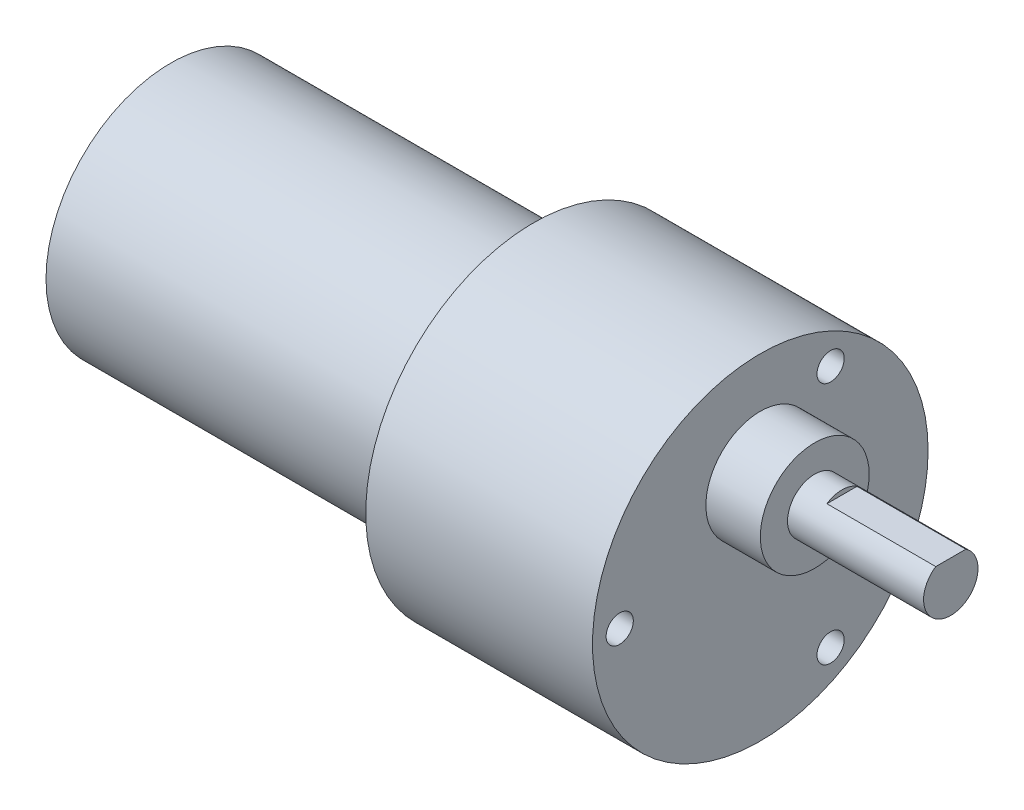
ISO-10303-21;
HEADER;
FILE_DESCRIPTION(('STEP AP214'),'2;1');
FILE_NAME('part.step','',(''),(''),'','','');
FILE_SCHEMA(('AUTOMOTIVE_DESIGN { 1 0 10303 214 1 1 1 1 }'));
ENDSEC;
DATA;
#1=APPLICATION_CONTEXT('core data for automotive mechanical design processes');
#2=APPLICATION_PROTOCOL_DEFINITION('international standard','automotive_design',2000,#1);
#3=PRODUCT_CONTEXT('',#1,'mechanical');
#4=PRODUCT('Part','Part','',(#3));
#5=PRODUCT_RELATED_PRODUCT_CATEGORY('part','',(#4));
#6=PRODUCT_DEFINITION_FORMATION('','',#4);
#7=PRODUCT_DEFINITION_CONTEXT('part definition',#1,'design');
#8=PRODUCT_DEFINITION('design','',#6,#7);
#9=PRODUCT_DEFINITION_SHAPE('','',#8);
#10=(LENGTH_UNIT() NAMED_UNIT(*) SI_UNIT(.MILLI.,.METRE.));
#11=(NAMED_UNIT(*) PLANE_ANGLE_UNIT() SI_UNIT($,.RADIAN.));
#12=(NAMED_UNIT(*) SI_UNIT($,.STERADIAN.) SOLID_ANGLE_UNIT());
#13=UNCERTAINTY_MEASURE_WITH_UNIT(LENGTH_MEASURE(1.E-05),#10,'distance_accuracy_value','');
#14=(GEOMETRIC_REPRESENTATION_CONTEXT(3) GLOBAL_UNCERTAINTY_ASSIGNED_CONTEXT((#13)) GLOBAL_UNIT_ASSIGNED_CONTEXT((#10,
#11,#12)) REPRESENTATION_CONTEXT('',''));
#15=CARTESIAN_POINT('',(0.,0.,0.));
#16=DIRECTION('',(0.,0.,1.));
#17=DIRECTION('',(1.,0.,0.));
#18=AXIS2_PLACEMENT_3D('',#15,#16,#17);
#19=CARTESIAN_POINT('',(20.,0.,0.));
#20=DIRECTION('',(-1.,0.,0.));
#21=DIRECTION('',(0.,0.,1.));
#22=AXIS2_PLACEMENT_3D('',#19,#20,#21);
#23=CYLINDRICAL_SURFACE('',#22,13.75);
#24=CARTESIAN_POINT('',(18.,0.,0.));
#25=DIRECTION('',(1.,0.,0.));
#26=DIRECTION('',(0.,0.,-1.));
#27=AXIS2_PLACEMENT_3D('',#24,#25,#26);
#28=CIRCLE('',#27,13.75);
#29=CARTESIAN_POINT('',(18.,0.,-13.75));
#30=VERTEX_POINT('',#29);
#31=EDGE_CURVE('E11',#30,#30,#28,.F.);
#32=ORIENTED_EDGE('',*,*,#31,.T.);
#33=EDGE_LOOP('',(#32));
#34=FACE_BOUND('',#33,.T.);
#35=CARTESIAN_POINT('',(-20.,0.,0.));
#36=DIRECTION('',(1.,0.,0.));
#37=DIRECTION('',(0.,0.,-1.));
#38=AXIS2_PLACEMENT_3D('',#35,#36,#37);
#39=CIRCLE('',#38,13.75);
#40=CARTESIAN_POINT('',(-20.,0.,-13.75));
#41=VERTEX_POINT('',#40);
#42=EDGE_CURVE('E100',#41,#41,#39,.T.);
#43=ORIENTED_EDGE('',*,*,#42,.T.);
#44=EDGE_LOOP('',(#43));
#45=FACE_BOUND('',#44,.T.);
#46=ADVANCED_FACE('F36',(#34,#45),#23,.T.);
#47=CARTESIAN_POINT('',(-20.,0.,0.));
#48=DIRECTION('',(1.,0.,0.));
#49=DIRECTION('',(0.,0.,-1.));
#50=AXIS2_PLACEMENT_3D('',#47,#48,#49);
#51=PLANE('',#50);
#52=CARTESIAN_POINT('',(-20.,0.,0.));
#53=DIRECTION('',(-1.,0.,0.));
#54=DIRECTION('',(0.,0.,1.));
#55=AXIS2_PLACEMENT_3D('',#52,#53,#54);
#56=CIRCLE('',#55,5.1);
#57=CARTESIAN_POINT('',(-20.,0.,5.1));
#58=VERTEX_POINT('',#57);
#59=EDGE_CURVE('E88',#58,#58,#56,.T.);
#60=ORIENTED_EDGE('',*,*,#59,.F.);
#61=EDGE_LOOP('',(#60));
#62=FACE_BOUND('',#61,.T.);
#63=ORIENTED_EDGE('',*,*,#42,.F.);
#64=EDGE_LOOP('',(#63));
#65=FACE_BOUND('',#64,.T.);
#66=ADVANCED_FACE('F121',(#62,#65),#51,.F.);
#67=CARTESIAN_POINT('',(-23.,0.,0.));
#68=DIRECTION('',(1.,0.,0.));
#69=DIRECTION('',(0.,0.,-1.));
#70=AXIS2_PLACEMENT_3D('',#67,#68,#69);
#71=CYLINDRICAL_SURFACE('',#70,5.1);
#72=CARTESIAN_POINT('',(-23.,0.,0.));
#73=DIRECTION('',(-1.,0.,0.));
#74=DIRECTION('',(0.,0.,1.));
#75=AXIS2_PLACEMENT_3D('',#72,#73,#74);
#76=CIRCLE('',#75,5.1);
#77=CARTESIAN_POINT('',(-23.,0.,5.1));
#78=VERTEX_POINT('',#77);
#79=EDGE_CURVE('E95',#78,#78,#76,.T.);
#80=ORIENTED_EDGE('',*,*,#79,.F.);
#81=EDGE_LOOP('',(#80));
#82=FACE_BOUND('',#81,.T.);
#83=ORIENTED_EDGE('',*,*,#59,.T.);
#84=EDGE_LOOP('',(#83));
#85=FACE_BOUND('',#84,.T.);
#86=ADVANCED_FACE('F126',(#82,#85),#71,.T.);
#87=CARTESIAN_POINT('',(-23.,0.,0.));
#88=DIRECTION('',(-1.,0.,0.));
#89=DIRECTION('',(0.,0.,1.));
#90=AXIS2_PLACEMENT_3D('',#87,#88,#89);
#91=PLANE('',#90);
#92=ORIENTED_EDGE('',*,*,#79,.T.);
#93=EDGE_LOOP('',(#92));
#94=FACE_BOUND('',#93,.T.);
#95=ADVANCED_FACE('F133',(#94),#91,.T.);
#96=CARTESIAN_POINT('',(45.,0.,0.));
#97=DIRECTION('',(-1.,0.,0.));
#98=DIRECTION('',(0.,0.,1.));
#99=AXIS2_PLACEMENT_3D('',#96,#97,#98);
#100=CYLINDRICAL_SURFACE('',#99,18.5);
#101=CARTESIAN_POINT('',(45.,0.,0.));
#102=DIRECTION('',(1.,0.,0.));
#103=DIRECTION('',(0.,0.,-1.));
#104=AXIS2_PLACEMENT_3D('',#101,#102,#103);
#105=CIRCLE('',#104,18.5);
#106=CARTESIAN_POINT('',(45.,0.,-18.5));
#107=VERTEX_POINT('',#106);
#108=EDGE_CURVE('E92',#107,#107,#105,.T.);
#109=ORIENTED_EDGE('',*,*,#108,.F.);
#110=EDGE_LOOP('',(#109));
#111=FACE_BOUND('',#110,.T.);
#112=CARTESIAN_POINT('',(20.,0.,0.));
#113=DIRECTION('',(1.,0.,0.));
#114=DIRECTION('',(0.,0.,-1.));
#115=AXIS2_PLACEMENT_3D('',#112,#113,#114);
#116=CIRCLE('',#115,18.5);
#117=CARTESIAN_POINT('',(20.,0.,-18.5));
#118=VERTEX_POINT('',#117);
#119=EDGE_CURVE('E90',#118,#118,#116,.T.);
#120=ORIENTED_EDGE('',*,*,#119,.T.);
#121=EDGE_LOOP('',(#120));
#122=FACE_BOUND('',#121,.T.);
#123=ADVANCED_FACE('F137',(#111,#122),#100,.T.);
#124=CARTESIAN_POINT('',(45.,0.,0.));
#125=DIRECTION('',(1.,0.,0.));
#126=DIRECTION('',(0.,0.,-1.));
#127=AXIS2_PLACEMENT_3D('',#124,#125,#126);
#128=PLANE('',#127);
#129=CARTESIAN_POINT('',(45.,0.,15.5));
#130=DIRECTION('',(1.,0.,0.));
#131=DIRECTION('',(0.,0.,-1.));
#132=AXIS2_PLACEMENT_3D('',#129,#130,#131);
#133=CIRCLE('',#132,1.5);
#134=CARTESIAN_POINT('',(45.,0.,14.));
#135=VERTEX_POINT('',#134);
#136=EDGE_CURVE('E191',#135,#135,#133,.T.);
#137=ORIENTED_EDGE('',*,*,#136,.F.);
#138=EDGE_LOOP('',(#137));
#139=FACE_BOUND('',#138,.T.);
#140=CARTESIAN_POINT('',(45.,13.4233937586588,-7.75000000000006));
#141=DIRECTION('',(1.,0.,0.));
#142=DIRECTION('',(0.,0.,-1.));
#143=AXIS2_PLACEMENT_3D('',#140,#141,#142);
#144=CIRCLE('',#143,1.5);
#145=CARTESIAN_POINT('',(45.,13.4233937586588,-9.25000000000006));
#146=VERTEX_POINT('',#145);
#147=EDGE_CURVE('E196',#146,#146,#144,.T.);
#148=ORIENTED_EDGE('',*,*,#147,.F.);
#149=EDGE_LOOP('',(#148));
#150=FACE_BOUND('',#149,.T.);
#151=CARTESIAN_POINT('',(45.,-13.4233937586589,-7.74999999999987));
#152=DIRECTION('',(1.,0.,0.));
#153=DIRECTION('',(0.,0.,-1.));
#154=AXIS2_PLACEMENT_3D('',#151,#152,#153);
#155=CIRCLE('',#154,1.5);
#156=CARTESIAN_POINT('',(45.,-13.4233937586589,-9.24999999999988));
#157=VERTEX_POINT('',#156);
#158=EDGE_CURVE('E204',#157,#157,#155,.T.);
#159=ORIENTED_EDGE('',*,*,#158,.F.);
#160=EDGE_LOOP('',(#159));
#161=FACE_BOUND('',#160,.T.);
#162=CARTESIAN_POINT('',(45.,7.,0.));
#163=DIRECTION('',(1.,0.,0.));
#164=DIRECTION('',(0.,0.,-1.));
#165=AXIS2_PLACEMENT_3D('',#162,#163,#164);
#166=CIRCLE('',#165,6.);
#167=CARTESIAN_POINT('',(45.,7.,-6.));
#168=VERTEX_POINT('',#167);
#169=EDGE_CURVE('E78',#168,#168,#166,.T.);
#170=ORIENTED_EDGE('',*,*,#169,.F.);
#171=EDGE_LOOP('',(#170));
#172=FACE_BOUND('',#171,.T.);
#173=ORIENTED_EDGE('',*,*,#108,.T.);
#174=EDGE_LOOP('',(#173));
#175=FACE_BOUND('',#174,.T.);
#176=ADVANCED_FACE('F141',(#139,#150,#161,#172,#175),#128,.T.);
#177=CARTESIAN_POINT('',(20.,0.,0.));
#178=DIRECTION('',(1.,0.,0.));
#179=DIRECTION('',(0.,0.,-1.));
#180=AXIS2_PLACEMENT_3D('',#177,#178,#179);
#181=PLANE('',#180);
#182=CARTESIAN_POINT('',(20.,0.,0.));
#183=DIRECTION('',(1.,0.,0.));
#184=DIRECTION('',(0.,0.,-1.));
#185=AXIS2_PLACEMENT_3D('',#182,#183,#184);
#186=CIRCLE('',#185,15.75);
#187=CARTESIAN_POINT('',(20.,0.,-15.75));
#188=VERTEX_POINT('',#187);
#189=EDGE_CURVE('E45',#188,#188,#186,.T.);
#190=ORIENTED_EDGE('',*,*,#189,.T.);
#191=EDGE_LOOP('',(#190));
#192=FACE_BOUND('',#191,.T.);
#193=ORIENTED_EDGE('',*,*,#119,.F.);
#194=EDGE_LOOP('',(#193));
#195=FACE_BOUND('',#194,.T.);
#196=ADVANCED_FACE('F107',(#192,#195),#181,.F.);
#197=CARTESIAN_POINT('',(51.,7.,0.));
#198=DIRECTION('',(-1.,0.,0.));
#199=DIRECTION('',(0.,0.,1.));
#200=AXIS2_PLACEMENT_3D('',#197,#198,#199);
#201=CYLINDRICAL_SURFACE('',#200,6.);
#202=CARTESIAN_POINT('',(51.,7.,0.));
#203=DIRECTION('',(1.,0.,0.));
#204=DIRECTION('',(0.,0.,-1.));
#205=AXIS2_PLACEMENT_3D('',#202,#203,#204);
#206=CIRCLE('',#205,6.);
#207=CARTESIAN_POINT('',(51.,7.,-6.));
#208=VERTEX_POINT('',#207);
#209=EDGE_CURVE('E81',#208,#208,#206,.T.);
#210=ORIENTED_EDGE('',*,*,#209,.F.);
#211=EDGE_LOOP('',(#210));
#212=FACE_BOUND('',#211,.T.);
#213=ORIENTED_EDGE('',*,*,#169,.T.);
#214=EDGE_LOOP('',(#213));
#215=FACE_BOUND('',#214,.T.);
#216=ADVANCED_FACE('F145',(#212,#215),#201,.T.);
#217=CARTESIAN_POINT('',(51.,7.,0.));
#218=DIRECTION('',(1.,0.,0.));
#219=DIRECTION('',(0.,0.,-1.));
#220=AXIS2_PLACEMENT_3D('',#217,#218,#219);
#221=PLANE('',#220);
#222=CARTESIAN_POINT('',(51.,7.,0.));
#223=DIRECTION('',(1.,0.,0.));
#224=DIRECTION('',(0.,0.,-1.));
#225=AXIS2_PLACEMENT_3D('',#222,#223,#224);
#226=CIRCLE('',#225,3.);
#227=CARTESIAN_POINT('',(51.,7.,-3.));
#228=VERTEX_POINT('',#227);
#229=EDGE_CURVE('E85',#228,#228,#226,.T.);
#230=ORIENTED_EDGE('',*,*,#229,.F.);
#231=EDGE_LOOP('',(#230));
#232=FACE_BOUND('',#231,.T.);
#233=ORIENTED_EDGE('',*,*,#209,.T.);
#234=EDGE_LOOP('',(#233));
#235=FACE_BOUND('',#234,.T.);
#236=ADVANCED_FACE('F151',(#232,#235),#221,.T.);
#237=CARTESIAN_POINT('',(66.,7.,0.));
#238=DIRECTION('',(-1.,0.,0.));
#239=DIRECTION('',(0.,0.,1.));
#240=AXIS2_PLACEMENT_3D('',#237,#238,#239);
#241=CYLINDRICAL_SURFACE('',#240,3.);
#242=CARTESIAN_POINT('',(66.,7.,0.));
#243=DIRECTION('',(1.,0.,0.));
#244=DIRECTION('',(0.,0.,-1.));
#245=AXIS2_PLACEMENT_3D('',#242,#243,#244);
#246=CIRCLE('',#245,3.);
#247=CARTESIAN_POINT('',(66.,9.5,1.6583123951777));
#248=VERTEX_POINT('',#247);
#249=CARTESIAN_POINT('',(66.,9.5,-1.6583123951777));
#250=VERTEX_POINT('',#249);
#251=EDGE_CURVE('E75',#248,#250,#246,.T.);
#252=ORIENTED_EDGE('',*,*,#251,.F.);
#253=DIRECTION('',(1.,0.,0.));
#254=VECTOR('',#253,1.);
#255=CARTESIAN_POINT('',(54.,9.5,1.6583123951777));
#256=LINE('',#255,#254);
#257=CARTESIAN_POINT('',(54.,9.5,1.6583123951777));
#258=VERTEX_POINT('',#257);
#259=EDGE_CURVE('E52',#258,#248,#256,.T.);
#260=ORIENTED_EDGE('',*,*,#259,.F.);
#261=CARTESIAN_POINT('',(54.,7.,0.));
#262=DIRECTION('',(1.,0.,0.));
#263=DIRECTION('',(0.,0.,-1.));
#264=AXIS2_PLACEMENT_3D('',#261,#262,#263);
#265=CIRCLE('',#264,3.);
#266=CARTESIAN_POINT('',(54.,9.5,-1.6583123951777));
#267=VERTEX_POINT('',#266);
#268=EDGE_CURVE('E68',#267,#258,#265,.T.);
#269=ORIENTED_EDGE('',*,*,#268,.F.);
#270=DIRECTION('',(1.,0.,0.));
#271=VECTOR('',#270,1.);
#272=CARTESIAN_POINT('',(54.,9.5,-1.6583123951777));
#273=LINE('',#272,#271);
#274=EDGE_CURVE('E58',#267,#250,#273,.T.);
#275=ORIENTED_EDGE('',*,*,#274,.T.);
#276=EDGE_LOOP('',(#252,#260,#269,#275));
#277=FACE_BOUND('',#276,.T.);
#278=ORIENTED_EDGE('',*,*,#229,.T.);
#279=EDGE_LOOP('',(#278));
#280=FACE_BOUND('',#279,.T.);
#281=ADVANCED_FACE('F73',(#277,#280),#241,.T.);
#282=CARTESIAN_POINT('',(66.,7.,0.));
#283=DIRECTION('',(1.,0.,0.));
#284=DIRECTION('',(0.,0.,-1.));
#285=AXIS2_PLACEMENT_3D('',#282,#283,#284);
#286=PLANE('',#285);
#287=DIRECTION('',(0.,0.,-1.));
#288=VECTOR('',#287,1.);
#289=CARTESIAN_POINT('',(66.,9.5,0.));
#290=LINE('',#289,#288);
#291=EDGE_CURVE('E63',#248,#250,#290,.T.);
#292=ORIENTED_EDGE('',*,*,#291,.F.);
#293=ORIENTED_EDGE('',*,*,#251,.T.);
#294=EDGE_LOOP('',(#292,#293));
#295=FACE_BOUND('',#294,.T.);
#296=ADVANCED_FACE('F77',(#295),#286,.T.);
#297=CARTESIAN_POINT('',(54.,9.5,0.));
#298=DIRECTION('',(0.,-1.,0.));
#299=DIRECTION('',(0.,0.,-1.));
#300=AXIS2_PLACEMENT_3D('',#297,#298,#299);
#301=PLANE('',#300);
#302=ORIENTED_EDGE('',*,*,#291,.T.);
#303=ORIENTED_EDGE('',*,*,#274,.F.);
#304=DIRECTION('',(0.,0.,-1.));
#305=VECTOR('',#304,1.);
#306=CARTESIAN_POINT('',(54.,9.5,0.));
#307=LINE('',#306,#305);
#308=EDGE_CURVE('E208',#258,#267,#307,.T.);
#309=ORIENTED_EDGE('',*,*,#308,.F.);
#310=ORIENTED_EDGE('',*,*,#259,.T.);
#311=EDGE_LOOP('',(#302,#303,#309,#310));
#312=FACE_BOUND('',#311,.T.);
#313=ADVANCED_FACE('F64',(#312),#301,.F.);
#314=CARTESIAN_POINT('',(54.,0.,0.));
#315=DIRECTION('',(1.,0.,0.));
#316=DIRECTION('',(0.,0.,-1.));
#317=AXIS2_PLACEMENT_3D('',#314,#315,#316);
#318=PLANE('',#317);
#319=ORIENTED_EDGE('',*,*,#268,.T.);
#320=ORIENTED_EDGE('',*,*,#308,.T.);
#321=EDGE_LOOP('',(#319,#320));
#322=FACE_BOUND('',#321,.T.);
#323=ADVANCED_FACE('F162',(#322),#318,.T.);
#324=CARTESIAN_POINT('',(42.,-13.4233937586589,-7.74999999999987));
#325=DIRECTION('',(1.,0.,0.));
#326=DIRECTION('',(0.,0.,-1.));
#327=AXIS2_PLACEMENT_3D('',#324,#325,#326);
#328=CYLINDRICAL_SURFACE('',#327,1.5);
#329=CARTESIAN_POINT('',(42.,-13.4233937586589,-7.74999999999987));
#330=DIRECTION('',(1.,0.,0.));
#331=DIRECTION('',(0.,0.,-1.));
#332=AXIS2_PLACEMENT_3D('',#329,#330,#331);
#333=CIRCLE('',#332,1.5);
#334=CARTESIAN_POINT('',(42.,-13.4233937586589,-9.24999999999988));
#335=VERTEX_POINT('',#334);
#336=EDGE_CURVE('E201',#335,#335,#333,.T.);
#337=ORIENTED_EDGE('',*,*,#336,.F.);
#338=EDGE_LOOP('',(#337));
#339=FACE_BOUND('',#338,.T.);
#340=ORIENTED_EDGE('',*,*,#158,.T.);
#341=EDGE_LOOP('',(#340));
#342=FACE_BOUND('',#341,.T.);
#343=ADVANCED_FACE('F165',(#339,#342),#328,.F.);
#344=CARTESIAN_POINT('',(42.,-13.4233937586589,-7.74999999999987));
#345=DIRECTION('',(1.,0.,0.));
#346=DIRECTION('',(0.,0.,-1.));
#347=AXIS2_PLACEMENT_3D('',#344,#345,#346);
#348=PLANE('',#347);
#349=ORIENTED_EDGE('',*,*,#336,.T.);
#350=EDGE_LOOP('',(#349));
#351=FACE_BOUND('',#350,.T.);
#352=ADVANCED_FACE('F169',(#351),#348,.T.);
#353=CARTESIAN_POINT('',(42.,13.4233937586588,-7.75000000000006));
#354=DIRECTION('',(1.,0.,0.));
#355=DIRECTION('',(0.,0.,-1.));
#356=AXIS2_PLACEMENT_3D('',#353,#354,#355);
#357=CYLINDRICAL_SURFACE('',#356,1.5);
#358=CARTESIAN_POINT('',(42.,13.4233937586588,-7.75000000000006));
#359=DIRECTION('',(1.,0.,0.));
#360=DIRECTION('',(0.,0.,-1.));
#361=AXIS2_PLACEMENT_3D('',#358,#359,#360);
#362=CIRCLE('',#361,1.5);
#363=CARTESIAN_POINT('',(42.,13.4233937586588,-9.25000000000006));
#364=VERTEX_POINT('',#363);
#365=EDGE_CURVE('E192',#364,#364,#362,.T.);
#366=ORIENTED_EDGE('',*,*,#365,.F.);
#367=EDGE_LOOP('',(#366));
#368=FACE_BOUND('',#367,.T.);
#369=ORIENTED_EDGE('',*,*,#147,.T.);
#370=EDGE_LOOP('',(#369));
#371=FACE_BOUND('',#370,.T.);
#372=ADVANCED_FACE('F173',(#368,#371),#357,.F.);
#373=CARTESIAN_POINT('',(42.,13.4233937586588,-7.75000000000006));
#374=DIRECTION('',(1.,0.,0.));
#375=DIRECTION('',(0.,0.,-1.));
#376=AXIS2_PLACEMENT_3D('',#373,#374,#375);
#377=PLANE('',#376);
#378=ORIENTED_EDGE('',*,*,#365,.T.);
#379=EDGE_LOOP('',(#378));
#380=FACE_BOUND('',#379,.T.);
#381=ADVANCED_FACE('F177',(#380),#377,.T.);
#382=CARTESIAN_POINT('',(42.,0.,15.5));
#383=DIRECTION('',(1.,0.,0.));
#384=DIRECTION('',(0.,0.,-1.));
#385=AXIS2_PLACEMENT_3D('',#382,#383,#384);
#386=CYLINDRICAL_SURFACE('',#385,1.5);
#387=CARTESIAN_POINT('',(42.,0.,15.5));
#388=DIRECTION('',(1.,0.,0.));
#389=DIRECTION('',(0.,0.,-1.));
#390=AXIS2_PLACEMENT_3D('',#387,#388,#389);
#391=CIRCLE('',#390,1.5);
#392=CARTESIAN_POINT('',(42.,0.,14.));
#393=VERTEX_POINT('',#392);
#394=EDGE_CURVE('E69',#393,#393,#391,.T.);
#395=ORIENTED_EDGE('',*,*,#394,.F.);
#396=EDGE_LOOP('',(#395));
#397=FACE_BOUND('',#396,.T.);
#398=ORIENTED_EDGE('',*,*,#136,.T.);
#399=EDGE_LOOP('',(#398));
#400=FACE_BOUND('',#399,.T.);
#401=ADVANCED_FACE('F116',(#397,#400),#386,.F.);
#402=CARTESIAN_POINT('',(42.,0.,15.5));
#403=DIRECTION('',(1.,0.,0.));
#404=DIRECTION('',(0.,0.,-1.));
#405=AXIS2_PLACEMENT_3D('',#402,#403,#404);
#406=PLANE('',#405);
#407=ORIENTED_EDGE('',*,*,#394,.T.);
#408=EDGE_LOOP('',(#407));
#409=FACE_BOUND('',#408,.T.);
#410=ADVANCED_FACE('F111',(#409),#406,.T.);
#411=CARTESIAN_POINT('',(20.,0.,0.));
#412=DIRECTION('',(1.,0.,0.));
#413=DIRECTION('',(0.,0.,-1.));
#414=AXIS2_PLACEMENT_3D('',#411,#412,#413);
#415=CONICAL_SURFACE('',#414,15.75,0.785398163397452);
#416=ORIENTED_EDGE('',*,*,#31,.F.);
#417=EDGE_LOOP('',(#416));
#418=FACE_BOUND('',#417,.T.);
#419=ORIENTED_EDGE('',*,*,#189,.F.);
#420=EDGE_LOOP('',(#419));
#421=FACE_BOUND('',#420,.T.);
#422=ADVANCED_FACE('F39',(#418,#421),#415,.T.);
#423=CLOSED_SHELL('',(#46,#66,#86,#95,#123,#176,#196,#216,#236,#281,#296,#313,#323,#343,#352,
#372,#381,#401,#410,#422));
#424=MANIFOLD_SOLID_BREP('B2',#423);
#425=ADVANCED_BREP_SHAPE_REPRESENTATION('',(#18,#424),#14);
#426=SHAPE_DEFINITION_REPRESENTATION(#9,#425);
ENDSEC;
END-ISO-10303-21;
